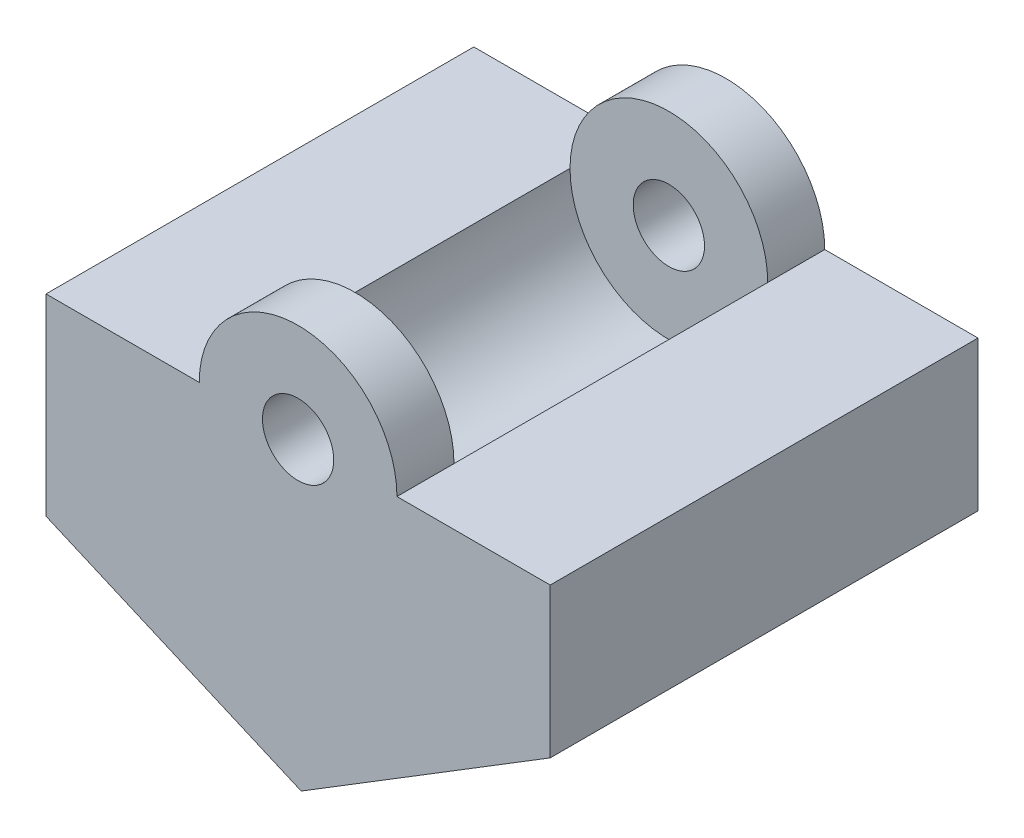
ISO-10303-21;
HEADER;
FILE_DESCRIPTION(('STEP AP214'),'2;1');
FILE_NAME('part.step','',(''),(''),'','','');
FILE_SCHEMA(('AUTOMOTIVE_DESIGN { 1 0 10303 214 1 1 1 1 }'));
ENDSEC;
DATA;
#1=APPLICATION_CONTEXT('core data for automotive mechanical design processes');
#2=APPLICATION_PROTOCOL_DEFINITION('international standard','automotive_design',2000,#1);
#3=PRODUCT_CONTEXT('',#1,'mechanical');
#4=PRODUCT('Part','Part','',(#3));
#5=PRODUCT_RELATED_PRODUCT_CATEGORY('part','',(#4));
#6=PRODUCT_DEFINITION_FORMATION('','',#4);
#7=PRODUCT_DEFINITION_CONTEXT('part definition',#1,'design');
#8=PRODUCT_DEFINITION('design','',#6,#7);
#9=PRODUCT_DEFINITION_SHAPE('','',#8);
#10=(LENGTH_UNIT() NAMED_UNIT(*) SI_UNIT(.MILLI.,.METRE.));
#11=(NAMED_UNIT(*) PLANE_ANGLE_UNIT() SI_UNIT($,.RADIAN.));
#12=(NAMED_UNIT(*) SI_UNIT($,.STERADIAN.) SOLID_ANGLE_UNIT());
#13=UNCERTAINTY_MEASURE_WITH_UNIT(LENGTH_MEASURE(1.E-05),#10,'distance_accuracy_value','');
#14=(GEOMETRIC_REPRESENTATION_CONTEXT(3) GLOBAL_UNCERTAINTY_ASSIGNED_CONTEXT((#13)) GLOBAL_UNIT_ASSIGNED_CONTEXT((#10,
#11,#12)) REPRESENTATION_CONTEXT('',''));
#15=CARTESIAN_POINT('',(0.,0.,0.));
#16=DIRECTION('',(0.,0.,1.));
#17=DIRECTION('',(1.,0.,0.));
#18=AXIS2_PLACEMENT_3D('',#15,#16,#17);
#19=CARTESIAN_POINT('',(-0.437210516499038,42.4860619414088,60.));
#20=DIRECTION('',(0.,0.,-1.));
#21=DIRECTION('',(-1.,0.,0.));
#22=AXIS2_PLACEMENT_3D('',#19,#20,#21);
#23=CYLINDRICAL_SURFACE('',#22,13.864092280803);
#24=CARTESIAN_POINT('',(-0.437210516499035,42.4860619414088,8.));
#25=DIRECTION('',(0.,0.,1.));
#26=DIRECTION('',(1.,0.,0.));
#27=AXIS2_PLACEMENT_3D('',#24,#25,#26);
#28=CIRCLE('',#27,13.864092280803);
#29=CARTESIAN_POINT('',(-14.301302797302,42.4860619414088,8.));
#30=VERTEX_POINT('',#29);
#31=CARTESIAN_POINT('',(13.426881764304,42.4860619414088,8.));
#32=VERTEX_POINT('',#31);
#33=EDGE_CURVE('E188',#30,#32,#28,.F.);
#34=ORIENTED_EDGE('',*,*,#33,.T.);
#35=DIRECTION('',(0.,0.,-1.));
#36=VECTOR('',#35,1.);
#37=CARTESIAN_POINT('',(13.426881764304,42.4860619414088,60.));
#38=LINE('',#37,#36);
#39=CARTESIAN_POINT('',(13.426881764304,42.4860619414088,0.));
#40=VERTEX_POINT('',#39);
#41=EDGE_CURVE('E166',#32,#40,#38,.T.);
#42=ORIENTED_EDGE('',*,*,#41,.T.);
#43=CARTESIAN_POINT('',(-0.437210516499038,42.4860619414088,0.));
#44=DIRECTION('',(0.,0.,1.));
#45=DIRECTION('',(1.,0.,0.));
#46=AXIS2_PLACEMENT_3D('',#43,#44,#45);
#47=CIRCLE('',#46,13.864092280803);
#48=CARTESIAN_POINT('',(-14.301302797302,42.4860619414088,0.));
#49=VERTEX_POINT('',#48);
#50=EDGE_CURVE('E154',#40,#49,#47,.T.);
#51=ORIENTED_EDGE('',*,*,#50,.T.);
#52=DIRECTION('',(0.,0.,-1.));
#53=VECTOR('',#52,1.);
#54=CARTESIAN_POINT('',(-14.301302797302,42.4860619414088,60.));
#55=LINE('',#54,#53);
#56=EDGE_CURVE('E136',#30,#49,#55,.T.);
#57=ORIENTED_EDGE('',*,*,#56,.F.);
#58=EDGE_LOOP('',(#34,#42,#51,#57));
#59=FACE_BOUND('',#58,.T.);
#60=ADVANCED_FACE('F42',(#59),#23,.T.);
#61=CARTESIAN_POINT('',(34.9191801485938,21.4860619414088,60.));
#62=DIRECTION('',(-0.524050291253873,0.851687320697409,0.));
#63=DIRECTION('',(-0.851687320697409,-0.524050291253873,0.));
#64=AXIS2_PLACEMENT_3D('',#61,#62,#63);
#65=PLANE('',#64);
#66=DIRECTION('',(0.851687320697409,0.524050291253873,0.));
#67=VECTOR('',#66,1.);
#68=CARTESIAN_POINT('',(34.9191801485938,21.4860619414088,0.));
#69=LINE('',#68,#67);
#70=CARTESIAN_POINT('',(0.,0.,0.));
#71=VERTEX_POINT('',#70);
#72=CARTESIAN_POINT('',(34.9191801485938,21.4860619414088,0.));
#73=VERTEX_POINT('',#72);
#74=EDGE_CURVE('E145',#71,#73,#69,.T.);
#75=ORIENTED_EDGE('',*,*,#74,.T.);
#76=DIRECTION('',(0.,0.,-1.));
#77=VECTOR('',#76,1.);
#78=CARTESIAN_POINT('',(34.9191801485938,21.4860619414088,60.));
#79=LINE('',#78,#77);
#80=CARTESIAN_POINT('',(34.9191801485938,21.4860619414088,60.));
#81=VERTEX_POINT('',#80);
#82=EDGE_CURVE('E12',#81,#73,#79,.T.);
#83=ORIENTED_EDGE('',*,*,#82,.F.);
#84=DIRECTION('',(0.851687320697409,0.524050291253873,0.));
#85=VECTOR('',#84,1.);
#86=CARTESIAN_POINT('',(34.9191801485938,21.4860619414088,60.));
#87=LINE('',#86,#85);
#88=CARTESIAN_POINT('',(0.,0.,60.));
#89=VERTEX_POINT('',#88);
#90=EDGE_CURVE('E161',#89,#81,#87,.T.);
#91=ORIENTED_EDGE('',*,*,#90,.F.);
#92=DIRECTION('',(0.,0.,-1.));
#93=VECTOR('',#92,1.);
#94=CARTESIAN_POINT('',(0.,0.,60.));
#95=LINE('',#94,#93);
#96=EDGE_CURVE('E141',#89,#71,#95,.T.);
#97=ORIENTED_EDGE('',*,*,#96,.T.);
#98=EDGE_LOOP('',(#75,#83,#91,#97));
#99=FACE_BOUND('',#98,.T.);
#100=ADVANCED_FACE('F44',(#99),#65,.F.);
#101=CARTESIAN_POINT('',(34.9191801485938,42.4860619414088,60.));
#102=DIRECTION('',(-1.,0.,0.));
#103=DIRECTION('',(0.,0.,1.));
#104=AXIS2_PLACEMENT_3D('',#101,#102,#103);
#105=PLANE('',#104);
#106=DIRECTION('',(0.,1.,0.));
#107=VECTOR('',#106,1.);
#108=CARTESIAN_POINT('',(34.9191801485938,42.4860619414088,0.));
#109=LINE('',#108,#107);
#110=CARTESIAN_POINT('',(34.9191801485938,42.4860619414088,0.));
#111=VERTEX_POINT('',#110);
#112=EDGE_CURVE('E148',#73,#111,#109,.T.);
#113=ORIENTED_EDGE('',*,*,#112,.T.);
#114=DIRECTION('',(0.,0.,-1.));
#115=VECTOR('',#114,1.);
#116=CARTESIAN_POINT('',(34.9191801485938,42.4860619414088,60.));
#117=LINE('',#116,#115);
#118=CARTESIAN_POINT('',(34.9191801485938,42.4860619414088,60.));
#119=VERTEX_POINT('',#118);
#120=EDGE_CURVE('E51',#119,#111,#117,.T.);
#121=ORIENTED_EDGE('',*,*,#120,.F.);
#122=DIRECTION('',(0.,1.,0.));
#123=VECTOR('',#122,1.);
#124=CARTESIAN_POINT('',(34.9191801485938,42.4860619414088,60.));
#125=LINE('',#124,#123);
#126=EDGE_CURVE('E105',#81,#119,#125,.T.);
#127=ORIENTED_EDGE('',*,*,#126,.F.);
#128=ORIENTED_EDGE('',*,*,#82,.T.);
#129=EDGE_LOOP('',(#113,#121,#127,#128));
#130=FACE_BOUND('',#129,.T.);
#131=ADVANCED_FACE('F215',(#130),#105,.F.);
#132=CARTESIAN_POINT('',(13.426881764304,42.4860619414088,60.));
#133=DIRECTION('',(0.,-1.,0.));
#134=DIRECTION('',(1.,0.,0.));
#135=AXIS2_PLACEMENT_3D('',#132,#133,#134);
#136=PLANE('',#135);
#137=DIRECTION('',(-1.,0.,0.));
#138=VECTOR('',#137,1.);
#139=CARTESIAN_POINT('',(13.426881764304,42.4860619414088,0.));
#140=LINE('',#139,#138);
#141=EDGE_CURVE('E151',#111,#40,#140,.T.);
#142=ORIENTED_EDGE('',*,*,#141,.T.);
#143=ORIENTED_EDGE('',*,*,#41,.F.);
#144=DIRECTION('',(0.,0.,1.));
#145=VECTOR('',#144,1.);
#146=CARTESIAN_POINT('',(13.426881764304,42.4860619414088,-39.2135746670075));
#147=LINE('',#146,#145);
#148=CARTESIAN_POINT('',(13.426881764304,42.4860619414088,52.));
#149=VERTEX_POINT('',#148);
#150=EDGE_CURVE('E149',#32,#149,#147,.T.);
#151=ORIENTED_EDGE('',*,*,#150,.T.);
#152=CARTESIAN_POINT('',(13.426881764304,42.4860619414088,60.));
#153=VERTEX_POINT('',#152);
#154=EDGE_CURVE('E168',#153,#149,#38,.T.);
#155=ORIENTED_EDGE('',*,*,#154,.F.);
#156=DIRECTION('',(-1.,0.,0.));
#157=VECTOR('',#156,1.);
#158=CARTESIAN_POINT('',(13.426881764304,42.4860619414088,60.));
#159=LINE('',#158,#157);
#160=EDGE_CURVE('E179',#119,#153,#159,.T.);
#161=ORIENTED_EDGE('',*,*,#160,.F.);
#162=ORIENTED_EDGE('',*,*,#120,.T.);
#163=EDGE_LOOP('',(#142,#143,#151,#155,#161,#162));
#164=FACE_BOUND('',#163,.T.);
#165=ADVANCED_FACE('F175',(#164),#136,.F.);
#166=ORIENTED_EDGE('',*,*,#154,.T.);
#167=CARTESIAN_POINT('',(-0.437210516499035,42.4860619414088,52.));
#168=DIRECTION('',(0.,0.,1.));
#169=DIRECTION('',(1.,0.,0.));
#170=AXIS2_PLACEMENT_3D('',#167,#168,#169);
#171=CIRCLE('',#170,13.864092280803);
#172=CARTESIAN_POINT('',(-14.301302797302,42.4860619414088,52.));
#173=VERTEX_POINT('',#172);
#174=EDGE_CURVE('E200',#149,#173,#171,.T.);
#175=ORIENTED_EDGE('',*,*,#174,.T.);
#176=CARTESIAN_POINT('',(-14.301302797302,42.4860619414088,60.));
#177=VERTEX_POINT('',#176);
#178=EDGE_CURVE('E164',#177,#173,#55,.T.);
#179=ORIENTED_EDGE('',*,*,#178,.F.);
#180=CARTESIAN_POINT('',(-0.437210516499038,42.4860619414088,60.));
#181=DIRECTION('',(0.,0.,1.));
#182=DIRECTION('',(1.,0.,0.));
#183=AXIS2_PLACEMENT_3D('',#180,#181,#182);
#184=CIRCLE('',#183,13.864092280803);
#185=EDGE_CURVE('E124',#153,#177,#184,.T.);
#186=ORIENTED_EDGE('',*,*,#185,.F.);
#187=EDGE_LOOP('',(#166,#175,#179,#186));
#188=FACE_BOUND('',#187,.T.);
#189=ADVANCED_FACE('F204',(#188),#23,.T.);
#190=CARTESIAN_POINT('',(-35.7936011815918,42.4860619414088,60.));
#191=DIRECTION('',(0.,-1.,0.));
#192=DIRECTION('',(0.,0.,-1.));
#193=AXIS2_PLACEMENT_3D('',#190,#191,#192);
#194=PLANE('',#193);
#195=DIRECTION('',(-1.,0.,0.));
#196=VECTOR('',#195,1.);
#197=CARTESIAN_POINT('',(-35.7936011815918,42.4860619414088,0.));
#198=LINE('',#197,#196);
#199=CARTESIAN_POINT('',(-35.7936011815918,42.4860619414088,0.));
#200=VERTEX_POINT('',#199);
#201=EDGE_CURVE('E133',#49,#200,#198,.T.);
#202=ORIENTED_EDGE('',*,*,#201,.T.);
#203=DIRECTION('',(0.,0.,-1.));
#204=VECTOR('',#203,1.);
#205=CARTESIAN_POINT('',(-35.7936011815918,42.4860619414088,60.));
#206=LINE('',#205,#204);
#207=CARTESIAN_POINT('',(-35.7936011815918,42.4860619414088,60.));
#208=VERTEX_POINT('',#207);
#209=EDGE_CURVE('E130',#208,#200,#206,.T.);
#210=ORIENTED_EDGE('',*,*,#209,.F.);
#211=DIRECTION('',(-1.,0.,0.));
#212=VECTOR('',#211,1.);
#213=CARTESIAN_POINT('',(-35.7936011815918,42.4860619414088,60.));
#214=LINE('',#213,#212);
#215=EDGE_CURVE('E117',#177,#208,#214,.T.);
#216=ORIENTED_EDGE('',*,*,#215,.F.);
#217=ORIENTED_EDGE('',*,*,#178,.T.);
#218=EDGE_CURVE('E167',#173,#30,#55,.T.);
#219=ORIENTED_EDGE('',*,*,#218,.T.);
#220=ORIENTED_EDGE('',*,*,#56,.T.);
#221=EDGE_LOOP('',(#202,#210,#216,#217,#219,#220));
#222=FACE_BOUND('',#221,.T.);
#223=ADVANCED_FACE('F131',(#222),#194,.F.);
#224=CARTESIAN_POINT('',(-35.7936011815918,15.4860619414088,60.));
#225=DIRECTION('',(1.,0.,0.));
#226=DIRECTION('',(0.,0.,-1.));
#227=AXIS2_PLACEMENT_3D('',#224,#225,#226);
#228=PLANE('',#227);
#229=DIRECTION('',(0.,-1.,0.));
#230=VECTOR('',#229,1.);
#231=CARTESIAN_POINT('',(-35.7936011815918,15.4860619414088,0.));
#232=LINE('',#231,#230);
#233=CARTESIAN_POINT('',(-35.7936011815918,15.4860619414088,0.));
#234=VERTEX_POINT('',#233);
#235=EDGE_CURVE('E158',#200,#234,#232,.T.);
#236=ORIENTED_EDGE('',*,*,#235,.T.);
#237=DIRECTION('',(0.,0.,-1.));
#238=VECTOR('',#237,1.);
#239=CARTESIAN_POINT('',(-35.7936011815918,15.4860619414088,60.));
#240=LINE('',#239,#238);
#241=CARTESIAN_POINT('',(-35.7936011815918,15.4860619414088,60.));
#242=VERTEX_POINT('',#241);
#243=EDGE_CURVE('E137',#242,#234,#240,.T.);
#244=ORIENTED_EDGE('',*,*,#243,.F.);
#245=DIRECTION('',(0.,-1.,0.));
#246=VECTOR('',#245,1.);
#247=CARTESIAN_POINT('',(-35.7936011815918,15.4860619414088,60.));
#248=LINE('',#247,#246);
#249=EDGE_CURVE('E121',#208,#242,#248,.T.);
#250=ORIENTED_EDGE('',*,*,#249,.F.);
#251=ORIENTED_EDGE('',*,*,#209,.T.);
#252=EDGE_LOOP('',(#236,#244,#250,#251));
#253=FACE_BOUND('',#252,.T.);
#254=ADVANCED_FACE('F139',(#253),#228,.F.);
#255=CARTESIAN_POINT('',(0.,0.,60.));
#256=DIRECTION('',(0.397078511318174,0.917784645681841,0.));
#257=DIRECTION('',(-0.917784645681841,0.397078511318174,0.));
#258=AXIS2_PLACEMENT_3D('',#255,#256,#257);
#259=PLANE('',#258);
#260=CARTESIAN_POINT('',(-26.6157547247714,11.5152768282262,50.9999999999941));
#261=DIRECTION('',(-0.397078511318174,-0.917784645681841,0.));
#262=DIRECTION('',(0.917784645681841,-0.397078511318174,0.));
#263=AXIS2_PLACEMENT_3D('',#260,#261,#262);
#264=CIRCLE('',#263,4.50000000000001);
#265=CARTESIAN_POINT('',(-22.4857238192031,9.72842352729441,50.9999999999941));
#266=VERTEX_POINT('',#265);
#267=EDGE_CURVE('E281',#266,#266,#264,.T.);
#268=ORIENTED_EDGE('',*,*,#267,.F.);
#269=EDGE_LOOP('',(#268));
#270=FACE_BOUND('',#269,.T.);
#271=CARTESIAN_POINT('',(-26.6157547247714,11.5152768282262,8.99999999999405));
#272=DIRECTION('',(-0.397078511318174,-0.917784645681841,0.));
#273=DIRECTION('',(0.917784645681841,-0.397078511318174,0.));
#274=AXIS2_PLACEMENT_3D('',#271,#272,#273);
#275=CIRCLE('',#274,4.50000000000001);
#276=CARTESIAN_POINT('',(-22.4857238192031,9.72842352729442,8.99999999999405));
#277=VERTEX_POINT('',#276);
#278=EDGE_CURVE('E286',#277,#277,#275,.T.);
#279=ORIENTED_EDGE('',*,*,#278,.F.);
#280=EDGE_LOOP('',(#279));
#281=FACE_BOUND('',#280,.T.);
#282=DIRECTION('',(0.917784645681841,-0.397078511318174,0.));
#283=VECTOR('',#282,1.);
#284=CARTESIAN_POINT('',(0.,0.,0.));
#285=LINE('',#284,#283);
#286=EDGE_CURVE('E97',#234,#71,#285,.T.);
#287=ORIENTED_EDGE('',*,*,#286,.T.);
#288=ORIENTED_EDGE('',*,*,#96,.F.);
#289=DIRECTION('',(0.917784645681841,-0.397078511318174,0.));
#290=VECTOR('',#289,1.);
#291=CARTESIAN_POINT('',(0.,0.,60.));
#292=LINE('',#291,#290);
#293=EDGE_CURVE('E67',#242,#89,#292,.T.);
#294=ORIENTED_EDGE('',*,*,#293,.F.);
#295=ORIENTED_EDGE('',*,*,#243,.T.);
#296=EDGE_LOOP('',(#287,#288,#294,#295));
#297=FACE_BOUND('',#296,.T.);
#298=ADVANCED_FACE('F235',(#270,#281,#297),#259,.F.);
#299=CARTESIAN_POINT('',(-0.437210516499038,42.4860619414088,60.));
#300=DIRECTION('',(0.,0.,1.));
#301=DIRECTION('',(1.,0.,0.));
#302=AXIS2_PLACEMENT_3D('',#299,#300,#301);
#303=PLANE('',#302);
#304=CARTESIAN_POINT('',(-0.437210516499035,42.4860619414088,60.));
#305=DIRECTION('',(0.,0.,1.));
#306=DIRECTION('',(1.,0.,0.));
#307=AXIS2_PLACEMENT_3D('',#304,#305,#306);
#308=CIRCLE('',#307,5.);
#309=CARTESIAN_POINT('',(4.56278948350097,42.4860619414088,60.));
#310=VERTEX_POINT('',#309);
#311=EDGE_CURVE('E280',#310,#310,#308,.T.);
#312=ORIENTED_EDGE('',*,*,#311,.F.);
#313=EDGE_LOOP('',(#312));
#314=FACE_BOUND('',#313,.T.);
#315=ORIENTED_EDGE('',*,*,#90,.T.);
#316=ORIENTED_EDGE('',*,*,#126,.T.);
#317=ORIENTED_EDGE('',*,*,#160,.T.);
#318=ORIENTED_EDGE('',*,*,#185,.T.);
#319=ORIENTED_EDGE('',*,*,#215,.T.);
#320=ORIENTED_EDGE('',*,*,#249,.T.);
#321=ORIENTED_EDGE('',*,*,#293,.T.);
#322=EDGE_LOOP('',(#315,#316,#317,#318,#319,#320,#321));
#323=FACE_BOUND('',#322,.T.);
#324=ADVANCED_FACE('F119',(#314,#323),#303,.T.);
#325=CARTESIAN_POINT('',(-0.437210516499038,42.4860619414088,0.));
#326=DIRECTION('',(0.,0.,1.));
#327=DIRECTION('',(1.,0.,0.));
#328=AXIS2_PLACEMENT_3D('',#325,#326,#327);
#329=PLANE('',#328);
#330=CARTESIAN_POINT('',(-0.437210516499035,42.4860619414088,0.));
#331=DIRECTION('',(0.,0.,1.));
#332=DIRECTION('',(1.,0.,0.));
#333=AXIS2_PLACEMENT_3D('',#330,#331,#332);
#334=CIRCLE('',#333,5.);
#335=CARTESIAN_POINT('',(4.56278948350097,42.4860619414088,0.));
#336=VERTEX_POINT('',#335);
#337=EDGE_CURVE('E284',#336,#336,#334,.T.);
#338=ORIENTED_EDGE('',*,*,#337,.T.);
#339=EDGE_LOOP('',(#338));
#340=FACE_BOUND('',#339,.T.);
#341=ORIENTED_EDGE('',*,*,#74,.F.);
#342=ORIENTED_EDGE('',*,*,#286,.F.);
#343=ORIENTED_EDGE('',*,*,#235,.F.);
#344=ORIENTED_EDGE('',*,*,#201,.F.);
#345=ORIENTED_EDGE('',*,*,#50,.F.);
#346=ORIENTED_EDGE('',*,*,#141,.F.);
#347=ORIENTED_EDGE('',*,*,#112,.F.);
#348=EDGE_LOOP('',(#341,#342,#343,#344,#345,#346,#347));
#349=FACE_BOUND('',#348,.T.);
#350=ADVANCED_FACE('F182',(#340,#349),#329,.F.);
#351=CARTESIAN_POINT('',(-0.437210516499035,42.4860619414088,-39.2135746670075));
#352=DIRECTION('',(0.,0.,1.));
#353=DIRECTION('',(1.,0.,0.));
#354=AXIS2_PLACEMENT_3D('',#351,#352,#353);
#355=CYLINDRICAL_SURFACE('',#354,13.864092280803);
#356=EDGE_CURVE('E58',#32,#30,#28,.F.);
#357=ORIENTED_EDGE('',*,*,#356,.T.);
#358=ORIENTED_EDGE('',*,*,#218,.F.);
#359=EDGE_CURVE('E194',#173,#149,#171,.T.);
#360=ORIENTED_EDGE('',*,*,#359,.T.);
#361=ORIENTED_EDGE('',*,*,#150,.F.);
#362=EDGE_LOOP('',(#357,#358,#360,#361));
#363=FACE_BOUND('',#362,.T.);
#364=ADVANCED_FACE('F196',(#363),#355,.F.);
#365=CARTESIAN_POINT('',(-0.437210516499035,42.4860619414088,52.));
#366=DIRECTION('',(0.,0.,1.));
#367=DIRECTION('',(1.,0.,0.));
#368=AXIS2_PLACEMENT_3D('',#365,#366,#367);
#369=PLANE('',#368);
#370=CARTESIAN_POINT('',(-0.437210516499035,42.4860619414088,52.));
#371=DIRECTION('',(0.,0.,1.));
#372=DIRECTION('',(1.,0.,0.));
#373=AXIS2_PLACEMENT_3D('',#370,#371,#372);
#374=CIRCLE('',#373,5.);
#375=CARTESIAN_POINT('',(4.56278948350097,42.4860619414088,52.));
#376=VERTEX_POINT('',#375);
#377=EDGE_CURVE('E201',#376,#376,#374,.T.);
#378=ORIENTED_EDGE('',*,*,#377,.T.);
#379=EDGE_LOOP('',(#378));
#380=FACE_BOUND('',#379,.T.);
#381=ORIENTED_EDGE('',*,*,#174,.F.);
#382=ORIENTED_EDGE('',*,*,#359,.F.);
#383=EDGE_LOOP('',(#381,#382));
#384=FACE_BOUND('',#383,.T.);
#385=ADVANCED_FACE('F199',(#380,#384),#369,.F.);
#386=CARTESIAN_POINT('',(-0.437210516499038,42.4860619414088,8.));
#387=DIRECTION('',(0.,0.,1.));
#388=DIRECTION('',(1.,0.,0.));
#389=AXIS2_PLACEMENT_3D('',#386,#387,#388);
#390=PLANE('',#389);
#391=CARTESIAN_POINT('',(-0.437210516499035,42.4860619414088,8.));
#392=DIRECTION('',(0.,0.,1.));
#393=DIRECTION('',(1.,0.,0.));
#394=AXIS2_PLACEMENT_3D('',#391,#392,#393);
#395=CIRCLE('',#394,5.);
#396=CARTESIAN_POINT('',(4.56278948350097,42.4860619414088,8.));
#397=VERTEX_POINT('',#396);
#398=EDGE_CURVE('E46',#397,#397,#395,.T.);
#399=ORIENTED_EDGE('',*,*,#398,.F.);
#400=EDGE_LOOP('',(#399));
#401=FACE_BOUND('',#400,.T.);
#402=ORIENTED_EDGE('',*,*,#356,.F.);
#403=ORIENTED_EDGE('',*,*,#33,.F.);
#404=EDGE_LOOP('',(#402,#403));
#405=FACE_BOUND('',#404,.T.);
#406=ADVANCED_FACE('F250',(#401,#405),#390,.T.);
#407=CARTESIAN_POINT('',(-0.437210516499035,42.4860619414088,0.));
#408=DIRECTION('',(0.,0.,1.));
#409=DIRECTION('',(1.,0.,0.));
#410=AXIS2_PLACEMENT_3D('',#407,#408,#409);
#411=CYLINDRICAL_SURFACE('',#410,5.);
#412=ORIENTED_EDGE('',*,*,#398,.T.);
#413=EDGE_LOOP('',(#412));
#414=FACE_BOUND('',#413,.T.);
#415=ORIENTED_EDGE('',*,*,#337,.F.);
#416=EDGE_LOOP('',(#415));
#417=FACE_BOUND('',#416,.T.);
#418=ADVANCED_FACE('F254',(#414,#417),#411,.F.);
#419=ORIENTED_EDGE('',*,*,#311,.T.);
#420=EDGE_LOOP('',(#419));
#421=FACE_BOUND('',#420,.T.);
#422=ORIENTED_EDGE('',*,*,#377,.F.);
#423=EDGE_LOOP('',(#422));
#424=FACE_BOUND('',#423,.T.);
#425=ADVANCED_FACE('F258',(#421,#424),#411,.F.);
#426=CARTESIAN_POINT('',(-20.6595770549988,25.2820465134538,8.99999999999405));
#427=DIRECTION('',(-0.397078511318174,-0.917784645681841,0.));
#428=DIRECTION('',(0.917784645681841,-0.397078511318174,0.));
#429=AXIS2_PLACEMENT_3D('',#426,#427,#428);
#430=CYLINDRICAL_SURFACE('',#429,4.50000000000001);
#431=CARTESIAN_POINT('',(-20.6595770549988,25.2820465134538,8.99999999999405));
#432=DIRECTION('',(-0.397078511318174,-0.917784645681841,0.));
#433=DIRECTION('',(0.917784645681841,-0.397078511318174,0.));
#434=AXIS2_PLACEMENT_3D('',#431,#432,#433);
#435=CIRCLE('',#434,4.50000000000001);
#436=CARTESIAN_POINT('',(-16.5295461494305,23.495193212522,8.99999999999405));
#437=VERTEX_POINT('',#436);
#438=EDGE_CURVE('E291',#437,#437,#435,.T.);
#439=ORIENTED_EDGE('',*,*,#438,.F.);
#440=EDGE_LOOP('',(#439));
#441=FACE_BOUND('',#440,.T.);
#442=ORIENTED_EDGE('',*,*,#278,.T.);
#443=EDGE_LOOP('',(#442));
#444=FACE_BOUND('',#443,.T.);
#445=ADVANCED_FACE('F264',(#441,#444),#430,.F.);
#446=CARTESIAN_POINT('',(-20.6595770549988,25.2820465134538,8.99999999999405));
#447=DIRECTION('',(-0.397078511318174,-0.917784645681841,0.));
#448=DIRECTION('',(0.917784645681841,-0.397078511318174,0.));
#449=AXIS2_PLACEMENT_3D('',#446,#447,#448);
#450=PLANE('',#449);
#451=ORIENTED_EDGE('',*,*,#438,.T.);
#452=EDGE_LOOP('',(#451));
#453=FACE_BOUND('',#452,.T.);
#454=ADVANCED_FACE('F260',(#453),#450,.T.);
#455=CARTESIAN_POINT('',(-20.6595770549988,25.2820465134538,50.9999999999941));
#456=DIRECTION('',(-0.397078511318174,-0.917784645681841,0.));
#457=DIRECTION('',(0.917784645681841,-0.397078511318174,0.));
#458=AXIS2_PLACEMENT_3D('',#455,#456,#457);
#459=CYLINDRICAL_SURFACE('',#458,4.50000000000001);
#460=CARTESIAN_POINT('',(-20.6595770549988,25.2820465134538,50.9999999999941));
#461=DIRECTION('',(-0.397078511318174,-0.917784645681841,0.));
#462=DIRECTION('',(0.917784645681841,-0.397078511318174,0.));
#463=AXIS2_PLACEMENT_3D('',#460,#461,#462);
#464=CIRCLE('',#463,4.50000000000001);
#465=CARTESIAN_POINT('',(-16.5295461494305,23.495193212522,50.9999999999941));
#466=VERTEX_POINT('',#465);
#467=EDGE_CURVE('E279',#466,#466,#464,.T.);
#468=ORIENTED_EDGE('',*,*,#467,.F.);
#469=EDGE_LOOP('',(#468));
#470=FACE_BOUND('',#469,.T.);
#471=ORIENTED_EDGE('',*,*,#267,.T.);
#472=EDGE_LOOP('',(#471));
#473=FACE_BOUND('',#472,.T.);
#474=ADVANCED_FACE('F263',(#470,#473),#459,.F.);
#475=CARTESIAN_POINT('',(-20.6595770549988,25.2820465134538,50.9999999999941));
#476=DIRECTION('',(-0.397078511318174,-0.917784645681841,0.));
#477=DIRECTION('',(0.917784645681841,-0.397078511318174,0.));
#478=AXIS2_PLACEMENT_3D('',#475,#476,#477);
#479=PLANE('',#478);
#480=ORIENTED_EDGE('',*,*,#467,.T.);
#481=EDGE_LOOP('',(#480));
#482=FACE_BOUND('',#481,.T.);
#483=ADVANCED_FACE('F271',(#482),#479,.T.);
#484=CLOSED_SHELL('',(#60,#100,#131,#165,#189,#223,#254,#298,#324,#350,#364,#385,#406,#418,#425,
#445,#454,#474,#483));
#485=MANIFOLD_SOLID_BREP('B2',#484);
#486=ADVANCED_BREP_SHAPE_REPRESENTATION('',(#18,#485),#14);
#487=SHAPE_DEFINITION_REPRESENTATION(#9,#486);
ENDSEC;
END-ISO-10303-21;
